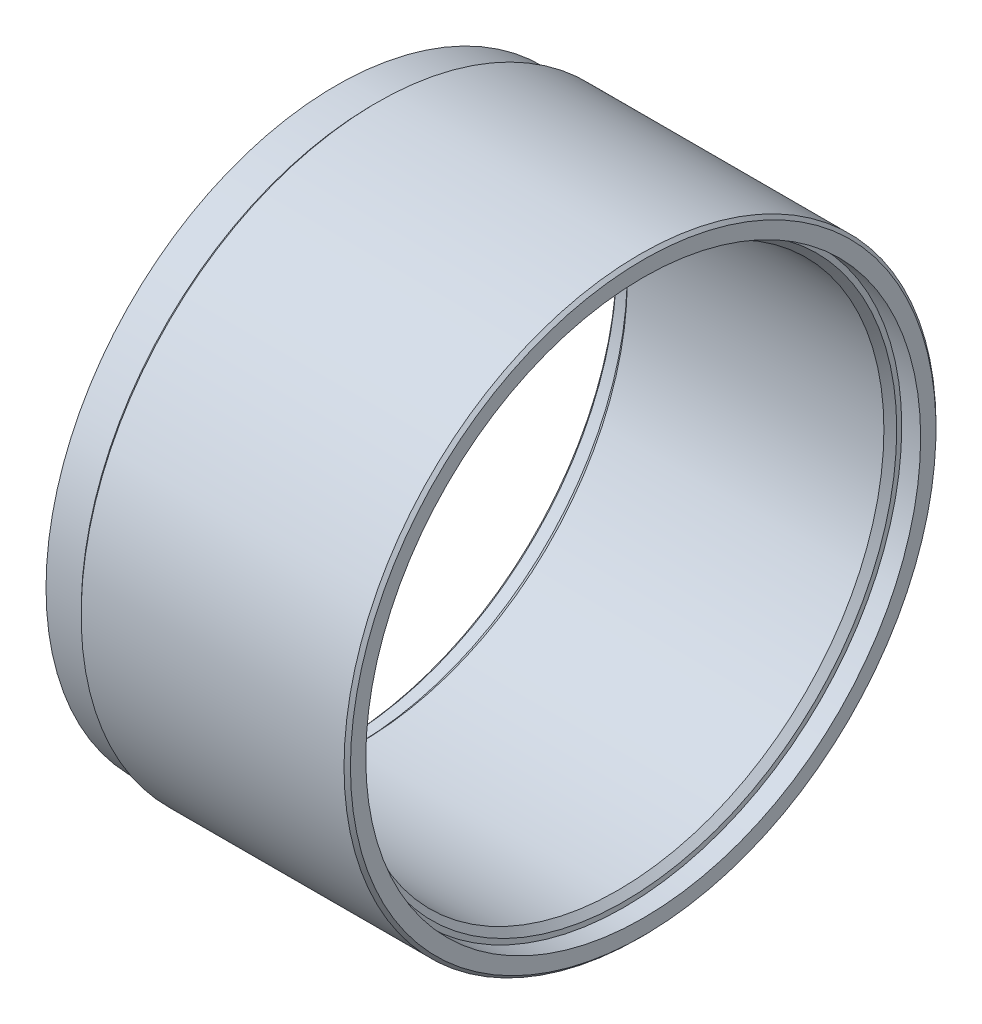
ISO-10303-21;
HEADER;
FILE_DESCRIPTION(('STEP AP214'),'2;1');
FILE_NAME('part.step','',(''),(''),'','','');
FILE_SCHEMA(('AUTOMOTIVE_DESIGN { 1 0 10303 214 1 1 1 1 }'));
ENDSEC;
DATA;
#1=APPLICATION_CONTEXT('core data for automotive mechanical design processes');
#2=APPLICATION_PROTOCOL_DEFINITION('international standard','automotive_design',2000,#1);
#3=PRODUCT_CONTEXT('',#1,'mechanical');
#4=PRODUCT('Part','Part','',(#3));
#5=PRODUCT_RELATED_PRODUCT_CATEGORY('part','',(#4));
#6=PRODUCT_DEFINITION_FORMATION('','',#4);
#7=PRODUCT_DEFINITION_CONTEXT('part definition',#1,'design');
#8=PRODUCT_DEFINITION('design','',#6,#7);
#9=PRODUCT_DEFINITION_SHAPE('','',#8);
#10=(LENGTH_UNIT() NAMED_UNIT(*) SI_UNIT(.MILLI.,.METRE.));
#11=(NAMED_UNIT(*) PLANE_ANGLE_UNIT() SI_UNIT($,.RADIAN.));
#12=(NAMED_UNIT(*) SI_UNIT($,.STERADIAN.) SOLID_ANGLE_UNIT());
#13=UNCERTAINTY_MEASURE_WITH_UNIT(LENGTH_MEASURE(1.E-05),#10,'distance_accuracy_value','');
#14=(GEOMETRIC_REPRESENTATION_CONTEXT(3) GLOBAL_UNCERTAINTY_ASSIGNED_CONTEXT((#13)) GLOBAL_UNIT_ASSIGNED_CONTEXT((#10,
#11,#12)) REPRESENTATION_CONTEXT('',''));
#15=CARTESIAN_POINT('',(0.,0.,0.));
#16=DIRECTION('',(0.,0.,1.));
#17=DIRECTION('',(1.,0.,0.));
#18=AXIS2_PLACEMENT_3D('',#15,#16,#17);
#19=CARTESIAN_POINT('',(15.6453877561219,0.,0.));
#20=DIRECTION('',(-1.,0.,0.));
#21=DIRECTION('',(0.,0.,1.));
#22=AXIS2_PLACEMENT_3D('',#19,#20,#21);
#23=CONICAL_SURFACE('',#22,21.602,0.785398163397445);
#24=CARTESIAN_POINT('',(16.1533877561219,0.,0.));
#25=DIRECTION('',(1.,0.,0.));
#26=DIRECTION('',(0.,0.,-1.));
#27=AXIS2_PLACEMENT_3D('',#24,#25,#26);
#28=CIRCLE('',#27,21.094);
#29=CARTESIAN_POINT('',(16.1533877561219,0.,-21.094));
#30=VERTEX_POINT('',#29);
#31=EDGE_CURVE('E39',#30,#30,#28,.T.);
#32=ORIENTED_EDGE('',*,*,#31,.T.);
#33=EDGE_LOOP('',(#32));
#34=FACE_BOUND('',#33,.T.);
#35=CARTESIAN_POINT('',(15.6453877561219,0.,0.));
#36=DIRECTION('',(-1.,0.,0.));
#37=DIRECTION('',(0.,0.,1.));
#38=AXIS2_PLACEMENT_3D('',#35,#36,#37);
#39=CIRCLE('',#38,21.602);
#40=CARTESIAN_POINT('',(15.6453877561219,0.,21.602));
#41=VERTEX_POINT('',#40);
#42=EDGE_CURVE('E18',#41,#41,#39,.F.);
#43=ORIENTED_EDGE('',*,*,#42,.F.);
#44=EDGE_LOOP('',(#43));
#45=FACE_BOUND('',#44,.T.);
#46=ADVANCED_FACE('F15',(#34,#45),#23,.F.);
#47=CARTESIAN_POINT('',(15.6453877561219,22.,0.));
#48=DIRECTION('',(-1.,0.,0.));
#49=DIRECTION('',(0.,0.,1.));
#50=AXIS2_PLACEMENT_3D('',#47,#48,#49);
#51=PLANE('',#50);
#52=ORIENTED_EDGE('',*,*,#42,.T.);
#53=EDGE_LOOP('',(#52));
#54=FACE_BOUND('',#53,.T.);
#55=CARTESIAN_POINT('',(15.6453877561219,0.,0.));
#56=DIRECTION('',(1.,0.,0.));
#57=DIRECTION('',(0.,0.,-1.));
#58=AXIS2_PLACEMENT_3D('',#55,#56,#57);
#59=CIRCLE('',#58,22.);
#60=CARTESIAN_POINT('',(15.6453877561219,0.,-22.));
#61=VERTEX_POINT('',#60);
#62=EDGE_CURVE('E42',#61,#61,#59,.F.);
#63=ORIENTED_EDGE('',*,*,#62,.T.);
#64=EDGE_LOOP('',(#63));
#65=FACE_BOUND('',#64,.T.);
#66=ADVANCED_FACE('F71',(#54,#65),#51,.T.);
#67=CARTESIAN_POINT('',(26.3292429912893,0.,0.));
#68=DIRECTION('',(1.,0.,0.));
#69=DIRECTION('',(0.,0.,-1.));
#70=AXIS2_PLACEMENT_3D('',#67,#68,#69);
#71=CYLINDRICAL_SURFACE('',#70,21.094);
#72=ORIENTED_EDGE('',*,*,#31,.F.);
#73=EDGE_LOOP('',(#72));
#74=FACE_BOUND('',#73,.T.);
#75=CARTESIAN_POINT('',(36.5050982264567,0.,0.));
#76=DIRECTION('',(1.,0.,0.));
#77=DIRECTION('',(0.,-1.,0.));
#78=AXIS2_PLACEMENT_3D('',#75,#76,#77);
#79=CIRCLE('',#78,21.094);
#80=CARTESIAN_POINT('',(36.5050982264567,-21.094,0.));
#81=VERTEX_POINT('',#80);
#82=EDGE_CURVE('E38',#81,#81,#79,.T.);
#83=ORIENTED_EDGE('',*,*,#82,.T.);
#84=EDGE_LOOP('',(#83));
#85=FACE_BOUND('',#84,.T.);
#86=ADVANCED_FACE('F76',(#74,#85),#71,.F.);
#87=CARTESIAN_POINT('',(14.9021468070864,0.,0.));
#88=DIRECTION('',(1.,0.,0.));
#89=DIRECTION('',(0.,0.,-1.));
#90=AXIS2_PLACEMENT_3D('',#87,#88,#89);
#91=CYLINDRICAL_SURFACE('',#90,22.);
#92=CARTESIAN_POINT('',(14.412905858051,0.,0.));
#93=DIRECTION('',(-1.,0.,0.));
#94=DIRECTION('',(0.,-1.,0.));
#95=AXIS2_PLACEMENT_3D('',#92,#93,#94);
#96=CIRCLE('',#95,22.);
#97=CARTESIAN_POINT('',(14.412905858051,-22.,0.));
#98=VERTEX_POINT('',#97);
#99=EDGE_CURVE('E34',#98,#98,#96,.T.);
#100=ORIENTED_EDGE('',*,*,#99,.T.);
#101=EDGE_LOOP('',(#100));
#102=FACE_BOUND('',#101,.T.);
#103=ORIENTED_EDGE('',*,*,#62,.F.);
#104=EDGE_LOOP('',(#103));
#105=FACE_BOUND('',#104,.T.);
#106=ADVANCED_FACE('F73',(#102,#105),#91,.F.);
#107=CARTESIAN_POINT('',(37.0130982264567,0.,0.));
#108=DIRECTION('',(1.,0.,0.));
#109=DIRECTION('',(0.,0.,-1.));
#110=AXIS2_PLACEMENT_3D('',#107,#108,#109);
#111=CONICAL_SURFACE('',#110,21.602,0.785398163397455);
#112=CARTESIAN_POINT('',(37.0130982264567,0.,0.));
#113=DIRECTION('',(1.,0.,0.));
#114=DIRECTION('',(0.,0.,-1.));
#115=AXIS2_PLACEMENT_3D('',#112,#113,#114);
#116=CIRCLE('',#115,21.602);
#117=CARTESIAN_POINT('',(37.0130982264567,0.,-21.602));
#118=VERTEX_POINT('',#117);
#119=EDGE_CURVE('E37',#118,#118,#116,.F.);
#120=ORIENTED_EDGE('',*,*,#119,.F.);
#121=EDGE_LOOP('',(#120));
#122=FACE_BOUND('',#121,.T.);
#123=ORIENTED_EDGE('',*,*,#82,.F.);
#124=EDGE_LOOP('',(#123));
#125=FACE_BOUND('',#124,.T.);
#126=ADVANCED_FACE('F75',(#122,#125),#111,.F.);
#127=CARTESIAN_POINT('',(14.158905858051,0.,0.));
#128=DIRECTION('',(-1.,0.,0.));
#129=DIRECTION('',(0.,0.,1.));
#130=AXIS2_PLACEMENT_3D('',#127,#128,#129);
#131=CONICAL_SURFACE('',#130,22.254,0.785398163397448);
#132=ORIENTED_EDGE('',*,*,#99,.F.);
#133=EDGE_LOOP('',(#132));
#134=FACE_BOUND('',#133,.T.);
#135=CARTESIAN_POINT('',(14.158905858051,0.,0.));
#136=DIRECTION('',(-1.,0.,0.));
#137=DIRECTION('',(0.,0.,1.));
#138=AXIS2_PLACEMENT_3D('',#135,#136,#137);
#139=CIRCLE('',#138,22.254);
#140=CARTESIAN_POINT('',(14.158905858051,0.,22.254));
#141=VERTEX_POINT('',#140);
#142=EDGE_CURVE('E64',#141,#141,#139,.F.);
#143=ORIENTED_EDGE('',*,*,#142,.F.);
#144=EDGE_LOOP('',(#143));
#145=FACE_BOUND('',#144,.T.);
#146=ADVANCED_FACE('F84',(#134,#145),#131,.F.);
#147=CARTESIAN_POINT('',(37.0130982264567,21.094,0.));
#148=DIRECTION('',(1.,0.,0.));
#149=DIRECTION('',(0.,0.,-1.));
#150=AXIS2_PLACEMENT_3D('',#147,#148,#149);
#151=PLANE('',#150);
#152=ORIENTED_EDGE('',*,*,#119,.T.);
#153=EDGE_LOOP('',(#152));
#154=FACE_BOUND('',#153,.T.);
#155=CARTESIAN_POINT('',(37.0130982264567,0.,0.));
#156=DIRECTION('',(1.,0.,0.));
#157=DIRECTION('',(0.,0.,-1.));
#158=AXIS2_PLACEMENT_3D('',#155,#156,#157);
#159=CIRCLE('',#158,22.);
#160=CARTESIAN_POINT('',(37.0130982264567,0.,-22.));
#161=VERTEX_POINT('',#160);
#162=EDGE_CURVE('E61',#161,#161,#159,.T.);
#163=ORIENTED_EDGE('',*,*,#162,.T.);
#164=EDGE_LOOP('',(#163));
#165=FACE_BOUND('',#164,.T.);
#166=ADVANCED_FACE('F123',(#154,#165),#151,.T.);
#167=CARTESIAN_POINT('',(14.158905858051,23.,0.));
#168=DIRECTION('',(-1.,0.,0.));
#169=DIRECTION('',(0.,0.,1.));
#170=AXIS2_PLACEMENT_3D('',#167,#168,#169);
#171=PLANE('',#170);
#172=ORIENTED_EDGE('',*,*,#142,.T.);
#173=EDGE_LOOP('',(#172));
#174=FACE_BOUND('',#173,.T.);
#175=CARTESIAN_POINT('',(14.158905858051,0.,0.));
#176=DIRECTION('',(1.,0.,0.));
#177=DIRECTION('',(0.,0.,-1.));
#178=AXIS2_PLACEMENT_3D('',#175,#176,#177);
#179=CIRCLE('',#178,23.);
#180=CARTESIAN_POINT('',(14.158905858051,0.,-23.));
#181=VERTEX_POINT('',#180);
#182=EDGE_CURVE('E58',#181,#181,#179,.T.);
#183=ORIENTED_EDGE('',*,*,#182,.F.);
#184=EDGE_LOOP('',(#183));
#185=FACE_BOUND('',#184,.T.);
#186=ADVANCED_FACE('F119',(#174,#185),#171,.T.);
#187=CARTESIAN_POINT('',(37.7630982264567,0.,0.));
#188=DIRECTION('',(1.,0.,0.));
#189=DIRECTION('',(0.,0.,-1.));
#190=AXIS2_PLACEMENT_3D('',#187,#188,#189);
#191=CYLINDRICAL_SURFACE('',#190,22.);
#192=ORIENTED_EDGE('',*,*,#162,.F.);
#193=EDGE_LOOP('',(#192));
#194=FACE_BOUND('',#193,.T.);
#195=CARTESIAN_POINT('',(38.5130982264567,0.,0.));
#196=DIRECTION('',(1.,0.,0.));
#197=DIRECTION('',(0.,0.,-1.));
#198=AXIS2_PLACEMENT_3D('',#195,#196,#197);
#199=CIRCLE('',#198,22.);
#200=CARTESIAN_POINT('',(38.5130982264567,0.,-22.));
#201=VERTEX_POINT('',#200);
#202=EDGE_CURVE('E55',#201,#201,#199,.F.);
#203=ORIENTED_EDGE('',*,*,#202,.F.);
#204=EDGE_LOOP('',(#203));
#205=FACE_BOUND('',#204,.T.);
#206=ADVANCED_FACE('F115',(#194,#205),#191,.F.);
#207=CARTESIAN_POINT('',(15.658905858051,0.,0.));
#208=DIRECTION('',(1.,0.,0.));
#209=DIRECTION('',(0.,0.,-1.));
#210=AXIS2_PLACEMENT_3D('',#207,#208,#209);
#211=CYLINDRICAL_SURFACE('',#210,23.);
#212=ORIENTED_EDGE('',*,*,#182,.T.);
#213=EDGE_LOOP('',(#212));
#214=FACE_BOUND('',#213,.T.);
#215=CARTESIAN_POINT('',(17.158905858051,0.,0.));
#216=DIRECTION('',(1.,0.,0.));
#217=DIRECTION('',(0.,0.,-1.));
#218=AXIS2_PLACEMENT_3D('',#215,#216,#217);
#219=CIRCLE('',#218,23.);
#220=CARTESIAN_POINT('',(17.158905858051,0.,-23.));
#221=VERTEX_POINT('',#220);
#222=EDGE_CURVE('E52',#221,#221,#219,.T.);
#223=ORIENTED_EDGE('',*,*,#222,.F.);
#224=EDGE_LOOP('',(#223));
#225=FACE_BOUND('',#224,.T.);
#226=ADVANCED_FACE('F111',(#214,#225),#211,.T.);
#227=CARTESIAN_POINT('',(38.5130982264567,22.,0.));
#228=DIRECTION('',(1.,0.,0.));
#229=DIRECTION('',(0.,0.,-1.));
#230=AXIS2_PLACEMENT_3D('',#227,#228,#229);
#231=PLANE('',#230);
#232=ORIENTED_EDGE('',*,*,#202,.T.);
#233=EDGE_LOOP('',(#232));
#234=FACE_BOUND('',#233,.T.);
#235=CARTESIAN_POINT('',(38.5130982264567,0.,0.));
#236=DIRECTION('',(-1.,0.,0.));
#237=DIRECTION('',(0.,0.,1.));
#238=AXIS2_PLACEMENT_3D('',#235,#236,#237);
#239=CIRCLE('',#238,23.2156);
#240=CARTESIAN_POINT('',(38.5130982264567,0.,23.2156));
#241=VERTEX_POINT('',#240);
#242=EDGE_CURVE('E49',#241,#241,#239,.T.);
#243=ORIENTED_EDGE('',*,*,#242,.F.);
#244=EDGE_LOOP('',(#243));
#245=FACE_BOUND('',#244,.T.);
#246=ADVANCED_FACE('F107',(#234,#245),#231,.T.);
#247=CARTESIAN_POINT('',(17.158905858051,23.4696,0.));
#248=DIRECTION('',(-1.,0.,0.));
#249=DIRECTION('',(0.,0.,1.));
#250=AXIS2_PLACEMENT_3D('',#247,#248,#249);
#251=PLANE('',#250);
#252=ORIENTED_EDGE('',*,*,#222,.T.);
#253=EDGE_LOOP('',(#252));
#254=FACE_BOUND('',#253,.T.);
#255=CARTESIAN_POINT('',(17.158905858051,0.,0.));
#256=DIRECTION('',(1.,0.,0.));
#257=DIRECTION('',(0.,0.,-1.));
#258=AXIS2_PLACEMENT_3D('',#255,#256,#257);
#259=CIRCLE('',#258,23.2156);
#260=CARTESIAN_POINT('',(17.158905858051,0.,-23.2156));
#261=VERTEX_POINT('',#260);
#262=EDGE_CURVE('E27',#261,#261,#259,.T.);
#263=ORIENTED_EDGE('',*,*,#262,.F.);
#264=EDGE_LOOP('',(#263));
#265=FACE_BOUND('',#264,.T.);
#266=ADVANCED_FACE('F103',(#254,#265),#251,.T.);
#267=CARTESIAN_POINT('',(38.2590982264567,0.,0.));
#268=DIRECTION('',(-1.,0.,0.));
#269=DIRECTION('',(0.,0.,1.));
#270=AXIS2_PLACEMENT_3D('',#267,#268,#269);
#271=CONICAL_SURFACE('',#270,23.4696,0.785398163397435);
#272=CARTESIAN_POINT('',(38.2590982264567,0.,0.));
#273=DIRECTION('',(1.,0.,0.));
#274=DIRECTION('',(0.,0.,-1.));
#275=AXIS2_PLACEMENT_3D('',#272,#273,#274);
#276=CIRCLE('',#275,23.4696);
#277=CARTESIAN_POINT('',(38.2590982264567,0.,-23.4696));
#278=VERTEX_POINT('',#277);
#279=EDGE_CURVE('E22',#278,#278,#276,.F.);
#280=ORIENTED_EDGE('',*,*,#279,.F.);
#281=EDGE_LOOP('',(#280));
#282=FACE_BOUND('',#281,.T.);
#283=ORIENTED_EDGE('',*,*,#242,.T.);
#284=EDGE_LOOP('',(#283));
#285=FACE_BOUND('',#284,.T.);
#286=ADVANCED_FACE('F96',(#282,#285),#271,.T.);
#287=CARTESIAN_POINT('',(17.412905858051,0.,0.));
#288=DIRECTION('',(1.,0.,0.));
#289=DIRECTION('',(0.,0.,-1.));
#290=AXIS2_PLACEMENT_3D('',#287,#288,#289);
#291=CONICAL_SURFACE('',#290,23.4696,0.785398163397442);
#292=ORIENTED_EDGE('',*,*,#262,.T.);
#293=EDGE_LOOP('',(#292));
#294=FACE_BOUND('',#293,.T.);
#295=CARTESIAN_POINT('',(17.412905858051,0.,0.));
#296=DIRECTION('',(1.,0.,0.));
#297=DIRECTION('',(0.,0.,-1.));
#298=AXIS2_PLACEMENT_3D('',#295,#296,#297);
#299=CIRCLE('',#298,23.4696);
#300=CARTESIAN_POINT('',(17.412905858051,0.,-23.4696));
#301=VERTEX_POINT('',#300);
#302=EDGE_CURVE('E10',#301,#301,#299,.T.);
#303=ORIENTED_EDGE('',*,*,#302,.F.);
#304=EDGE_LOOP('',(#303));
#305=FACE_BOUND('',#304,.T.);
#306=ADVANCED_FACE('F91',(#294,#305),#291,.T.);
#307=CARTESIAN_POINT('',(27.8360020422539,0.,0.));
#308=DIRECTION('',(1.,0.,0.));
#309=DIRECTION('',(0.,0.,-1.));
#310=AXIS2_PLACEMENT_3D('',#307,#308,#309);
#311=CYLINDRICAL_SURFACE('',#310,23.4696);
#312=ORIENTED_EDGE('',*,*,#302,.T.);
#313=EDGE_LOOP('',(#312));
#314=FACE_BOUND('',#313,.T.);
#315=ORIENTED_EDGE('',*,*,#279,.T.);
#316=EDGE_LOOP('',(#315));
#317=FACE_BOUND('',#316,.T.);
#318=ADVANCED_FACE('F89',(#314,#317),#311,.T.);
#319=CLOSED_SHELL('',(#46,#66,#86,#106,#126,#146,#166,#186,#206,#226,#246,#266,#286,#306,#318));
#320=MANIFOLD_SOLID_BREP('B1',#319);
#321=ADVANCED_BREP_SHAPE_REPRESENTATION('',(#18,#320),#14);
#322=SHAPE_DEFINITION_REPRESENTATION(#9,#321);
ENDSEC;
END-ISO-10303-21;
